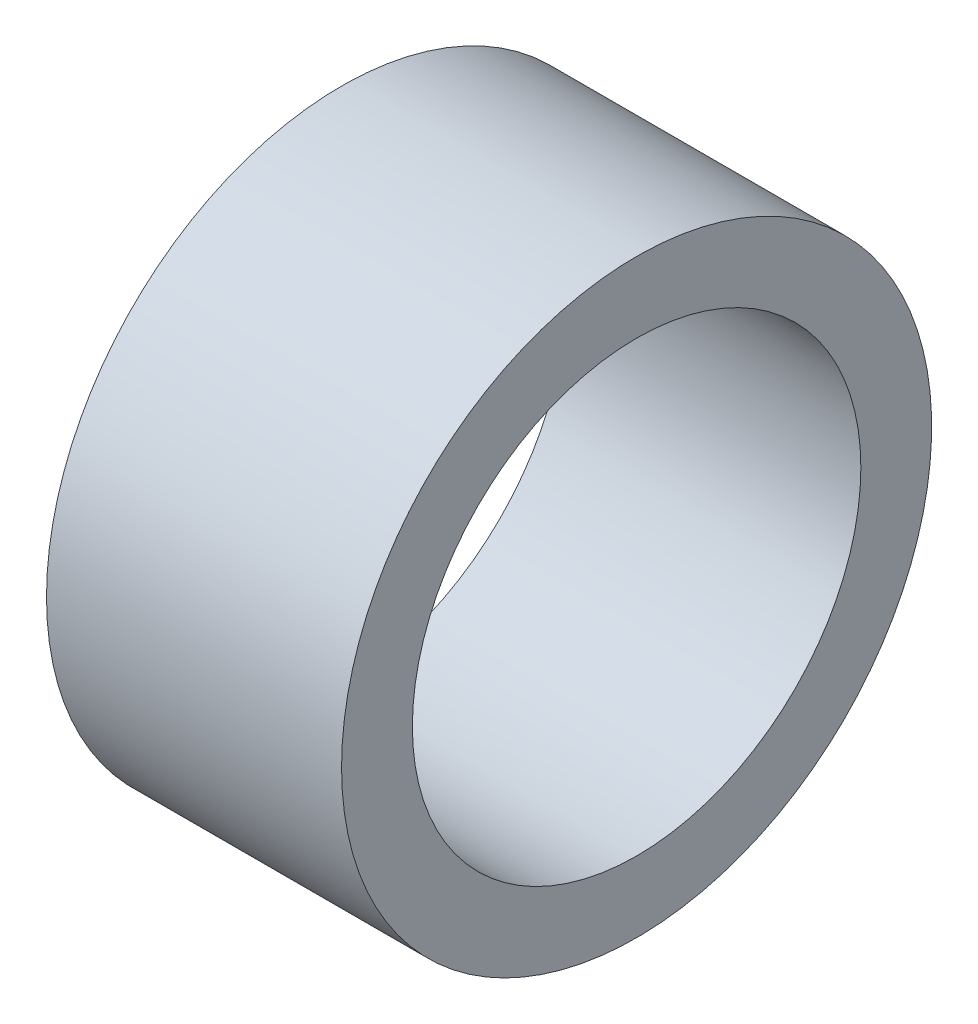
ISO-10303-21;
HEADER;
FILE_DESCRIPTION(('STEP AP214'),'2;1');
FILE_NAME('part.step','',(''),(''),'','','');
FILE_SCHEMA(('AUTOMOTIVE_DESIGN { 1 0 10303 214 1 1 1 1 }'));
ENDSEC;
DATA;
#1=APPLICATION_CONTEXT('core data for automotive mechanical design processes');
#2=APPLICATION_PROTOCOL_DEFINITION('international standard','automotive_design',2000,#1);
#3=PRODUCT_CONTEXT('',#1,'mechanical');
#4=PRODUCT('Part','Part','',(#3));
#5=PRODUCT_RELATED_PRODUCT_CATEGORY('part','',(#4));
#6=PRODUCT_DEFINITION_FORMATION('','',#4);
#7=PRODUCT_DEFINITION_CONTEXT('part definition',#1,'design');
#8=PRODUCT_DEFINITION('design','',#6,#7);
#9=PRODUCT_DEFINITION_SHAPE('','',#8);
#10=(LENGTH_UNIT() NAMED_UNIT(*) SI_UNIT(.MILLI.,.METRE.));
#11=(NAMED_UNIT(*) PLANE_ANGLE_UNIT() SI_UNIT($,.RADIAN.));
#12=(NAMED_UNIT(*) SI_UNIT($,.STERADIAN.) SOLID_ANGLE_UNIT());
#13=UNCERTAINTY_MEASURE_WITH_UNIT(LENGTH_MEASURE(1.E-05),#10,'distance_accuracy_value','');
#14=(GEOMETRIC_REPRESENTATION_CONTEXT(3) GLOBAL_UNCERTAINTY_ASSIGNED_CONTEXT((#13)) GLOBAL_UNIT_ASSIGNED_CONTEXT((#10,
#11,#12)) REPRESENTATION_CONTEXT('',''));
#15=CARTESIAN_POINT('',(0.,0.,0.));
#16=DIRECTION('',(0.,0.,1.));
#17=DIRECTION('',(1.,0.,0.));
#18=AXIS2_PLACEMENT_3D('',#15,#16,#17);
#19=CARTESIAN_POINT('',(10.007,10.007,10.007));
#20=DIRECTION('',(-1.,0.,0.));
#21=DIRECTION('',(0.,0.,1.));
#22=AXIS2_PLACEMENT_3D('',#19,#20,#21);
#23=CYLINDRICAL_SURFACE('',#22,7.6);
#24=CARTESIAN_POINT('',(10.007,10.007,10.007));
#25=DIRECTION('',(-1.,0.,0.));
#26=DIRECTION('',(0.,0.,1.));
#27=AXIS2_PLACEMENT_3D('',#24,#25,#26);
#28=CIRCLE('',#27,7.6);
#29=CARTESIAN_POINT('',(10.007,10.007,17.607));
#30=VERTEX_POINT('',#29);
#31=EDGE_CURVE('E17',#30,#30,#28,.F.);
#32=ORIENTED_EDGE('',*,*,#31,.T.);
#33=EDGE_LOOP('',(#32));
#34=FACE_BOUND('',#33,.T.);
#35=CARTESIAN_POINT('',(0.00699999999994802,10.007,10.007));
#36=DIRECTION('',(-1.,0.,0.));
#37=DIRECTION('',(0.,0.,1.));
#38=AXIS2_PLACEMENT_3D('',#35,#36,#37);
#39=CIRCLE('',#38,7.6);
#40=CARTESIAN_POINT('',(0.00699999999994802,10.007,17.607));
#41=VERTEX_POINT('',#40);
#42=EDGE_CURVE('E26',#41,#41,#39,.F.);
#43=ORIENTED_EDGE('',*,*,#42,.F.);
#44=EDGE_LOOP('',(#43));
#45=FACE_BOUND('',#44,.T.);
#46=ADVANCED_FACE('F14',(#34,#45),#23,.F.);
#47=CARTESIAN_POINT('',(10.007,10.007,10.007));
#48=DIRECTION('',(-1.,0.,0.));
#49=DIRECTION('',(0.,0.,1.));
#50=AXIS2_PLACEMENT_3D('',#47,#48,#49);
#51=PLANE('',#50);
#52=ORIENTED_EDGE('',*,*,#31,.F.);
#53=EDGE_LOOP('',(#52));
#54=FACE_BOUND('',#53,.T.);
#55=CARTESIAN_POINT('',(10.007,10.007,10.007));
#56=DIRECTION('',(-1.,0.,0.));
#57=DIRECTION('',(0.,0.,1.));
#58=AXIS2_PLACEMENT_3D('',#55,#56,#57);
#59=CIRCLE('',#58,10.);
#60=CARTESIAN_POINT('',(10.007,10.007,20.007));
#61=VERTEX_POINT('',#60);
#62=EDGE_CURVE('E21',#61,#61,#59,.T.);
#63=ORIENTED_EDGE('',*,*,#62,.F.);
#64=EDGE_LOOP('',(#63));
#65=FACE_BOUND('',#64,.T.);
#66=ADVANCED_FACE('F36',(#54,#65),#51,.F.);
#67=CARTESIAN_POINT('',(0.006999999999948,10.007,10.007));
#68=DIRECTION('',(-1.,0.,0.));
#69=DIRECTION('',(0.,0.,1.));
#70=AXIS2_PLACEMENT_3D('',#67,#68,#69);
#71=PLANE('',#70);
#72=ORIENTED_EDGE('',*,*,#42,.T.);
#73=EDGE_LOOP('',(#72));
#74=FACE_BOUND('',#73,.T.);
#75=CARTESIAN_POINT('',(0.00699999999994802,10.007,10.007));
#76=DIRECTION('',(-1.,0.,0.));
#77=DIRECTION('',(0.,0.,1.));
#78=AXIS2_PLACEMENT_3D('',#75,#76,#77);
#79=CIRCLE('',#78,10.);
#80=CARTESIAN_POINT('',(0.00699999999994802,10.007,20.007));
#81=VERTEX_POINT('',#80);
#82=EDGE_CURVE('E10',#81,#81,#79,.F.);
#83=ORIENTED_EDGE('',*,*,#82,.F.);
#84=EDGE_LOOP('',(#83));
#85=FACE_BOUND('',#84,.T.);
#86=ADVANCED_FACE('F39',(#74,#85),#71,.T.);
#87=CARTESIAN_POINT('',(10.007,10.007,10.007));
#88=DIRECTION('',(-1.,0.,0.));
#89=DIRECTION('',(0.,0.,1.));
#90=AXIS2_PLACEMENT_3D('',#87,#88,#89);
#91=CYLINDRICAL_SURFACE('',#90,10.);
#92=ORIENTED_EDGE('',*,*,#62,.T.);
#93=EDGE_LOOP('',(#92));
#94=FACE_BOUND('',#93,.T.);
#95=ORIENTED_EDGE('',*,*,#82,.T.);
#96=EDGE_LOOP('',(#95));
#97=FACE_BOUND('',#96,.T.);
#98=ADVANCED_FACE('F42',(#94,#97),#91,.T.);
#99=CLOSED_SHELL('',(#46,#66,#86,#98));
#100=MANIFOLD_SOLID_BREP('B1',#99);
#101=ADVANCED_BREP_SHAPE_REPRESENTATION('',(#18,#100),#14);
#102=SHAPE_DEFINITION_REPRESENTATION(#9,#101);
ENDSEC;
END-ISO-10303-21;
